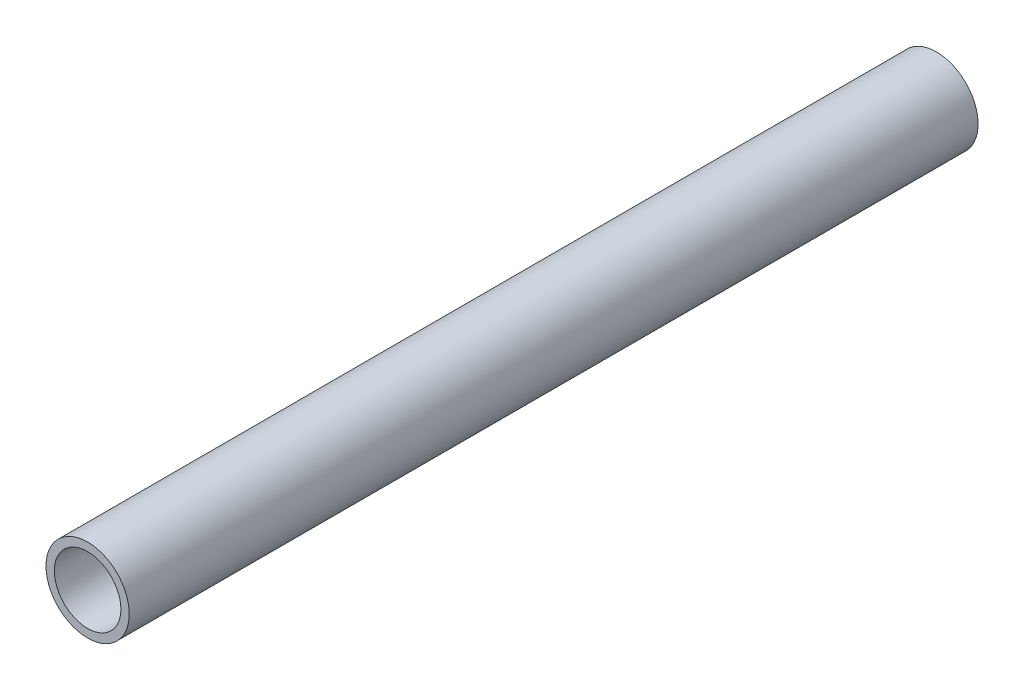
ISO-10303-21;
HEADER;
FILE_DESCRIPTION(('STEP AP214'),'2;1');
FILE_NAME('part.step','',(''),(''),'','','');
FILE_SCHEMA(('AUTOMOTIVE_DESIGN { 1 0 10303 214 1 1 1 1 }'));
ENDSEC;
DATA;
#1=APPLICATION_CONTEXT('core data for automotive mechanical design processes');
#2=APPLICATION_PROTOCOL_DEFINITION('international standard','automotive_design',2000,#1);
#3=PRODUCT_CONTEXT('',#1,'mechanical');
#4=PRODUCT('Part','Part','',(#3));
#5=PRODUCT_RELATED_PRODUCT_CATEGORY('part','',(#4));
#6=PRODUCT_DEFINITION_FORMATION('','',#4);
#7=PRODUCT_DEFINITION_CONTEXT('part definition',#1,'design');
#8=PRODUCT_DEFINITION('design','',#6,#7);
#9=PRODUCT_DEFINITION_SHAPE('','',#8);
#10=(LENGTH_UNIT() NAMED_UNIT(*) SI_UNIT(.MILLI.,.METRE.));
#11=(NAMED_UNIT(*) PLANE_ANGLE_UNIT() SI_UNIT($,.RADIAN.));
#12=(NAMED_UNIT(*) SI_UNIT($,.STERADIAN.) SOLID_ANGLE_UNIT());
#13=UNCERTAINTY_MEASURE_WITH_UNIT(LENGTH_MEASURE(1.E-05),#10,'distance_accuracy_value','');
#14=(GEOMETRIC_REPRESENTATION_CONTEXT(3) GLOBAL_UNCERTAINTY_ASSIGNED_CONTEXT((#13)) GLOBAL_UNIT_ASSIGNED_CONTEXT((#10,
#11,#12)) REPRESENTATION_CONTEXT('',''));
#15=CARTESIAN_POINT('',(0.,0.,0.));
#16=DIRECTION('',(0.,0.,1.));
#17=DIRECTION('',(1.,0.,0.));
#18=AXIS2_PLACEMENT_3D('',#15,#16,#17);
#19=CARTESIAN_POINT('',(0.,0.,100.));
#20=DIRECTION('',(0.,0.,1.));
#21=DIRECTION('',(1.,0.,0.));
#22=AXIS2_PLACEMENT_3D('',#19,#20,#21);
#23=PLANE('',#22);
#24=CARTESIAN_POINT('',(0.,0.,100.));
#25=DIRECTION('',(0.,0.,1.));
#26=DIRECTION('',(1.,0.,0.));
#27=AXIS2_PLACEMENT_3D('',#24,#25,#26);
#28=CIRCLE('',#27,5.);
#29=CARTESIAN_POINT('',(5.,0.,100.));
#30=VERTEX_POINT('',#29);
#31=EDGE_CURVE('E10',#30,#30,#28,.T.);
#32=ORIENTED_EDGE('',*,*,#31,.T.);
#33=EDGE_LOOP('',(#32));
#34=FACE_BOUND('',#33,.T.);
#35=CARTESIAN_POINT('',(0.,0.,100.));
#36=DIRECTION('',(0.,0.,1.));
#37=DIRECTION('',(1.,0.,0.));
#38=AXIS2_PLACEMENT_3D('',#35,#36,#37);
#39=CIRCLE('',#38,4.);
#40=CARTESIAN_POINT('',(4.,0.,100.));
#41=VERTEX_POINT('',#40);
#42=EDGE_CURVE('E42',#41,#41,#39,.T.);
#43=ORIENTED_EDGE('',*,*,#42,.F.);
#44=EDGE_LOOP('',(#43));
#45=FACE_BOUND('',#44,.T.);
#46=ADVANCED_FACE('F35',(#34,#45),#23,.T.);
#47=CARTESIAN_POINT('',(0.,0.,100.));
#48=DIRECTION('',(0.,0.,-1.));
#49=DIRECTION('',(-1.,0.,0.));
#50=AXIS2_PLACEMENT_3D('',#47,#48,#49);
#51=CYLINDRICAL_SURFACE('',#50,5.);
#52=ORIENTED_EDGE('',*,*,#31,.F.);
#53=EDGE_LOOP('',(#52));
#54=FACE_BOUND('',#53,.T.);
#55=CARTESIAN_POINT('',(0.,0.,-2.));
#56=DIRECTION('',(0.,0.,-1.));
#57=DIRECTION('',(-1.,0.,0.));
#58=AXIS2_PLACEMENT_3D('',#55,#56,#57);
#59=CIRCLE('',#58,5.);
#60=CARTESIAN_POINT('',(-5.,0.,-2.));
#61=VERTEX_POINT('',#60);
#62=EDGE_CURVE('E51',#61,#61,#59,.T.);
#63=ORIENTED_EDGE('',*,*,#62,.F.);
#64=EDGE_LOOP('',(#63));
#65=FACE_BOUND('',#64,.T.);
#66=ADVANCED_FACE('F37',(#54,#65),#51,.T.);
#67=CARTESIAN_POINT('',(0.,0.,100.));
#68=DIRECTION('',(0.,0.,-1.));
#69=DIRECTION('',(-1.,0.,0.));
#70=AXIS2_PLACEMENT_3D('',#67,#68,#69);
#71=CYLINDRICAL_SURFACE('',#70,4.);
#72=ORIENTED_EDGE('',*,*,#42,.T.);
#73=EDGE_LOOP('',(#72));
#74=FACE_BOUND('',#73,.T.);
#75=CARTESIAN_POINT('',(0.,0.,0.));
#76=DIRECTION('',(0.,0.,1.));
#77=DIRECTION('',(1.,0.,0.));
#78=AXIS2_PLACEMENT_3D('',#75,#76,#77);
#79=CIRCLE('',#78,4.);
#80=CARTESIAN_POINT('',(4.,0.,0.));
#81=VERTEX_POINT('',#80);
#82=EDGE_CURVE('E46',#81,#81,#79,.T.);
#83=ORIENTED_EDGE('',*,*,#82,.F.);
#84=EDGE_LOOP('',(#83));
#85=FACE_BOUND('',#84,.T.);
#86=ADVANCED_FACE('F59',(#74,#85),#71,.F.);
#87=CARTESIAN_POINT('',(0.,0.,0.));
#88=DIRECTION('',(0.,0.,-1.));
#89=DIRECTION('',(-1.,0.,0.));
#90=AXIS2_PLACEMENT_3D('',#87,#88,#89);
#91=PLANE('',#90);
#92=ORIENTED_EDGE('',*,*,#82,.T.);
#93=EDGE_LOOP('',(#92));
#94=FACE_BOUND('',#93,.T.);
#95=ADVANCED_FACE('F65',(#94),#91,.F.);
#96=CARTESIAN_POINT('',(0.,0.,-2.));
#97=DIRECTION('',(0.,0.,-1.));
#98=DIRECTION('',(-1.,0.,0.));
#99=AXIS2_PLACEMENT_3D('',#96,#97,#98);
#100=PLANE('',#99);
#101=ORIENTED_EDGE('',*,*,#62,.T.);
#102=EDGE_LOOP('',(#101));
#103=FACE_BOUND('',#102,.T.);
#104=ADVANCED_FACE('F56',(#103),#100,.T.);
#105=CLOSED_SHELL('',(#46,#66,#86,#95,#104));
#106=MANIFOLD_SOLID_BREP('B2',#105);
#107=ADVANCED_BREP_SHAPE_REPRESENTATION('',(#18,#106),#14);
#108=SHAPE_DEFINITION_REPRESENTATION(#9,#107);
ENDSEC;
END-ISO-10303-21;
